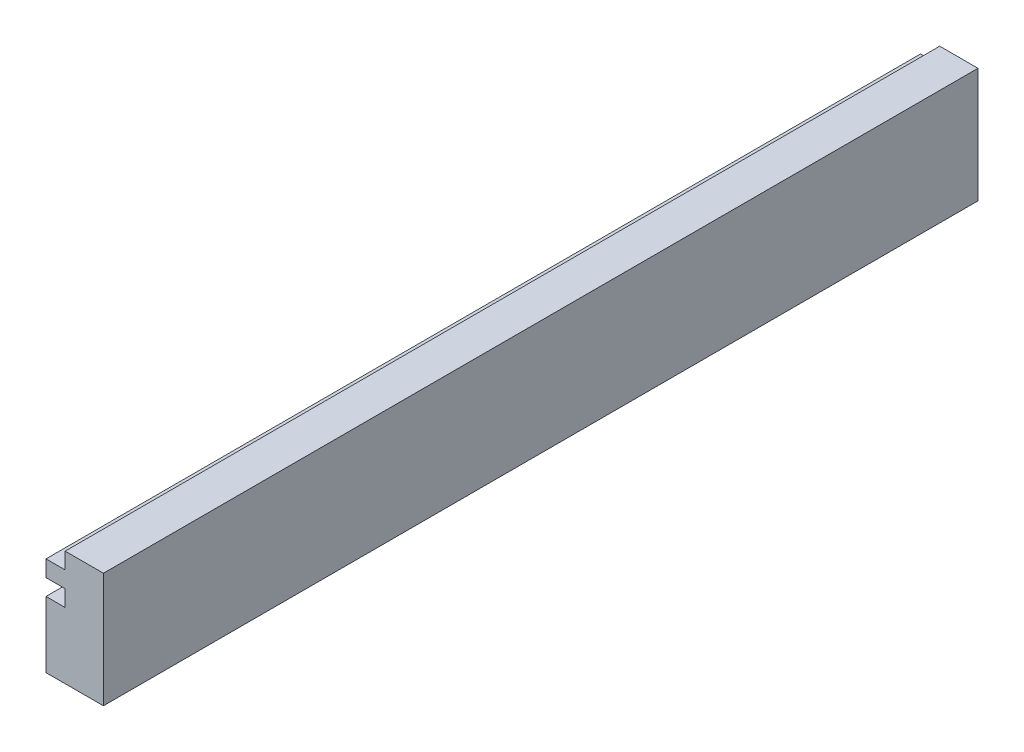
ISO-10303-21;
HEADER;
FILE_DESCRIPTION(('STEP AP214'),'2;1');
FILE_NAME('part.step','',(''),(''),'','','');
FILE_SCHEMA(('AUTOMOTIVE_DESIGN { 1 0 10303 214 1 1 1 1 }'));
ENDSEC;
DATA;
#1=APPLICATION_CONTEXT('core data for automotive mechanical design processes');
#2=APPLICATION_PROTOCOL_DEFINITION('international standard','automotive_design',2000,#1);
#3=PRODUCT_CONTEXT('',#1,'mechanical');
#4=PRODUCT('Part','Part','',(#3));
#5=PRODUCT_RELATED_PRODUCT_CATEGORY('part','',(#4));
#6=PRODUCT_DEFINITION_FORMATION('','',#4);
#7=PRODUCT_DEFINITION_CONTEXT('part definition',#1,'design');
#8=PRODUCT_DEFINITION('design','',#6,#7);
#9=PRODUCT_DEFINITION_SHAPE('','',#8);
#10=(LENGTH_UNIT() NAMED_UNIT(*) SI_UNIT(.MILLI.,.METRE.));
#11=(NAMED_UNIT(*) PLANE_ANGLE_UNIT() SI_UNIT($,.RADIAN.));
#12=(NAMED_UNIT(*) SI_UNIT($,.STERADIAN.) SOLID_ANGLE_UNIT());
#13=UNCERTAINTY_MEASURE_WITH_UNIT(LENGTH_MEASURE(1.E-05),#10,'distance_accuracy_value','');
#14=(GEOMETRIC_REPRESENTATION_CONTEXT(3) GLOBAL_UNCERTAINTY_ASSIGNED_CONTEXT((#13)) GLOBAL_UNIT_ASSIGNED_CONTEXT((#10,
#11,#12)) REPRESENTATION_CONTEXT('',''));
#15=CARTESIAN_POINT('',(0.,0.,0.));
#16=DIRECTION('',(0.,0.,1.));
#17=DIRECTION('',(1.,0.,0.));
#18=AXIS2_PLACEMENT_3D('',#15,#16,#17);
#19=CARTESIAN_POINT('',(0.,0.,457.));
#20=DIRECTION('',(1.,0.,0.));
#21=DIRECTION('',(0.,0.,-1.));
#22=AXIS2_PLACEMENT_3D('',#19,#20,#21);
#23=PLANE('',#22);
#24=DIRECTION('',(0.,0.,1.));
#25=VECTOR('',#24,1.);
#26=CARTESIAN_POINT('',(0.,43.,-43.));
#27=LINE('',#26,#25);
#28=CARTESIAN_POINT('',(0.,43.,0.));
#29=VERTEX_POINT('',#28);
#30=CARTESIAN_POINT('',(0.,43.,457.));
#31=VERTEX_POINT('',#30);
#32=EDGE_CURVE('E172',#29,#31,#27,.T.);
#33=ORIENTED_EDGE('',*,*,#32,.T.);
#34=DIRECTION('',(0.,-1.,0.));
#35=VECTOR('',#34,1.);
#36=CARTESIAN_POINT('',(0.,0.,457.));
#37=LINE('',#36,#35);
#38=CARTESIAN_POINT('',(0.,51.5,457.));
#39=VERTEX_POINT('',#38);
#40=EDGE_CURVE('E195',#39,#31,#37,.T.);
#41=ORIENTED_EDGE('',*,*,#40,.F.);
#42=DIRECTION('',(0.,0.,1.));
#43=VECTOR('',#42,1.);
#44=CARTESIAN_POINT('',(0.,51.5,-43.));
#45=LINE('',#44,#43);
#46=CARTESIAN_POINT('',(0.,51.5,0.));
#47=VERTEX_POINT('',#46);
#48=EDGE_CURVE('E186',#47,#39,#45,.T.);
#49=ORIENTED_EDGE('',*,*,#48,.F.);
#50=DIRECTION('',(0.,-1.,0.));
#51=VECTOR('',#50,1.);
#52=CARTESIAN_POINT('',(0.,0.,0.));
#53=LINE('',#52,#51);
#54=EDGE_CURVE('E206',#47,#29,#53,.T.);
#55=ORIENTED_EDGE('',*,*,#54,.T.);
#56=EDGE_LOOP('',(#33,#41,#49,#55));
#57=FACE_BOUND('',#56,.T.);
#58=ADVANCED_FACE('F33',(#57),#23,.F.);
#59=CARTESIAN_POINT('',(0.,60.,457.));
#60=DIRECTION('',(0.,-1.,0.));
#61=DIRECTION('',(0.,0.,-1.));
#62=AXIS2_PLACEMENT_3D('',#59,#60,#61);
#63=PLANE('',#62);
#64=DIRECTION('',(0.,0.,1.));
#65=VECTOR('',#64,1.);
#66=CARTESIAN_POINT('',(10.,60.,-43.));
#67=LINE('',#66,#65);
#68=CARTESIAN_POINT('',(10.,60.,0.));
#69=VERTEX_POINT('',#68);
#70=CARTESIAN_POINT('',(10.,60.,457.));
#71=VERTEX_POINT('',#70);
#72=EDGE_CURVE('E183',#69,#71,#67,.T.);
#73=ORIENTED_EDGE('',*,*,#72,.T.);
#74=DIRECTION('',(-1.,0.,0.));
#75=VECTOR('',#74,1.);
#76=CARTESIAN_POINT('',(0.,60.,457.));
#77=LINE('',#76,#75);
#78=CARTESIAN_POINT('',(30.,60.,457.));
#79=VERTEX_POINT('',#78);
#80=EDGE_CURVE('E201',#79,#71,#77,.T.);
#81=ORIENTED_EDGE('',*,*,#80,.F.);
#82=DIRECTION('',(0.,0.,-1.));
#83=VECTOR('',#82,1.);
#84=CARTESIAN_POINT('',(30.,60.,457.));
#85=LINE('',#84,#83);
#86=CARTESIAN_POINT('',(30.,60.,0.));
#87=VERTEX_POINT('',#86);
#88=EDGE_CURVE('E204',#79,#87,#85,.T.);
#89=ORIENTED_EDGE('',*,*,#88,.T.);
#90=DIRECTION('',(-1.,0.,0.));
#91=VECTOR('',#90,1.);
#92=CARTESIAN_POINT('',(0.,60.,0.));
#93=LINE('',#92,#91);
#94=EDGE_CURVE('E196',#87,#69,#93,.T.);
#95=ORIENTED_EDGE('',*,*,#94,.T.);
#96=EDGE_LOOP('',(#73,#81,#89,#95));
#97=FACE_BOUND('',#96,.T.);
#98=ADVANCED_FACE('F287',(#97),#63,.F.);
#99=CARTESIAN_POINT('',(0.,0.,457.));
#100=DIRECTION('',(0.,0.,-1.));
#101=DIRECTION('',(-1.,0.,0.));
#102=AXIS2_PLACEMENT_3D('',#99,#100,#101);
#103=PLANE('',#102);
#104=DIRECTION('',(1.,0.,0.));
#105=VECTOR('',#104,1.);
#106=CARTESIAN_POINT('',(0.,43.,457.));
#107=LINE('',#106,#105);
#108=CARTESIAN_POINT('',(10.0000000000002,43.,457.));
#109=VERTEX_POINT('',#108);
#110=EDGE_CURVE('E168',#31,#109,#107,.T.);
#111=ORIENTED_EDGE('',*,*,#110,.T.);
#112=DIRECTION('',(0.,-1.,0.));
#113=VECTOR('',#112,1.);
#114=CARTESIAN_POINT('',(10.0000000000002,0.,457.));
#115=LINE('',#114,#113);
#116=CARTESIAN_POINT('',(10.0000000000002,34.5,457.));
#117=VERTEX_POINT('',#116);
#118=EDGE_CURVE('E164',#109,#117,#115,.T.);
#119=ORIENTED_EDGE('',*,*,#118,.T.);
#120=DIRECTION('',(1.,0.,0.));
#121=VECTOR('',#120,1.);
#122=CARTESIAN_POINT('',(0.,34.5,457.));
#123=LINE('',#122,#121);
#124=CARTESIAN_POINT('',(0.,34.5,457.));
#125=VERTEX_POINT('',#124);
#126=EDGE_CURVE('E162',#125,#117,#123,.T.);
#127=ORIENTED_EDGE('',*,*,#126,.F.);
#128=CARTESIAN_POINT('',(0.,0.,457.));
#129=VERTEX_POINT('',#128);
#130=EDGE_CURVE('E193',#125,#129,#37,.T.);
#131=ORIENTED_EDGE('',*,*,#130,.T.);
#132=DIRECTION('',(1.,0.,0.));
#133=VECTOR('',#132,1.);
#134=CARTESIAN_POINT('',(0.,0.,457.));
#135=LINE('',#134,#133);
#136=CARTESIAN_POINT('',(30.,0.,457.));
#137=VERTEX_POINT('',#136);
#138=EDGE_CURVE('E197',#129,#137,#135,.T.);
#139=ORIENTED_EDGE('',*,*,#138,.T.);
#140=DIRECTION('',(0.,1.,0.));
#141=VECTOR('',#140,1.);
#142=CARTESIAN_POINT('',(30.,0.,457.));
#143=LINE('',#142,#141);
#144=EDGE_CURVE('E199',#137,#79,#143,.T.);
#145=ORIENTED_EDGE('',*,*,#144,.T.);
#146=ORIENTED_EDGE('',*,*,#80,.T.);
#147=DIRECTION('',(0.,-1.,0.));
#148=VECTOR('',#147,1.);
#149=CARTESIAN_POINT('',(10.,60.,457.));
#150=LINE('',#149,#148);
#151=CARTESIAN_POINT('',(10.,51.5,457.));
#152=VERTEX_POINT('',#151);
#153=EDGE_CURVE('E182',#71,#152,#150,.T.);
#154=ORIENTED_EDGE('',*,*,#153,.T.);
#155=DIRECTION('',(1.,0.,0.));
#156=VECTOR('',#155,1.);
#157=CARTESIAN_POINT('',(0.,51.5,457.));
#158=LINE('',#157,#156);
#159=EDGE_CURVE('E165',#39,#152,#158,.T.);
#160=ORIENTED_EDGE('',*,*,#159,.F.);
#161=ORIENTED_EDGE('',*,*,#40,.T.);
#162=EDGE_LOOP('',(#111,#119,#127,#131,#139,#145,#146,#154,#160,#161));
#163=FACE_BOUND('',#162,.T.);
#164=ADVANCED_FACE('F246',(#163),#103,.F.);
#165=CARTESIAN_POINT('',(0.,0.,0.));
#166=DIRECTION('',(0.,0.,-1.));
#167=DIRECTION('',(-1.,0.,0.));
#168=AXIS2_PLACEMENT_3D('',#165,#166,#167);
#169=PLANE('',#168);
#170=DIRECTION('',(-1.,0.,0.));
#171=VECTOR('',#170,1.);
#172=CARTESIAN_POINT('',(0.,17.5,0.));
#173=LINE('',#172,#171);
#174=CARTESIAN_POINT('',(10.,17.5,0.));
#175=VERTEX_POINT('',#174);
#176=CARTESIAN_POINT('',(0.,17.5,0.));
#177=VERTEX_POINT('',#176);
#178=EDGE_CURVE('E150',#175,#177,#173,.T.);
#179=ORIENTED_EDGE('',*,*,#178,.F.);
#180=DIRECTION('',(0.,-1.,0.));
#181=VECTOR('',#180,1.);
#182=CARTESIAN_POINT('',(10.,26.,0.));
#183=LINE('',#182,#181);
#184=CARTESIAN_POINT('',(10.,26.,0.));
#185=VERTEX_POINT('',#184);
#186=EDGE_CURVE('E267',#185,#175,#183,.T.);
#187=ORIENTED_EDGE('',*,*,#186,.F.);
#188=DIRECTION('',(1.,0.,0.));
#189=VECTOR('',#188,1.);
#190=CARTESIAN_POINT('',(0.,26.,0.));
#191=LINE('',#190,#189);
#192=CARTESIAN_POINT('',(0.,26.,0.));
#193=VERTEX_POINT('',#192);
#194=EDGE_CURVE('E265',#193,#185,#191,.T.);
#195=ORIENTED_EDGE('',*,*,#194,.F.);
#196=CARTESIAN_POINT('',(0.,34.5,0.));
#197=VERTEX_POINT('',#196);
#198=EDGE_CURVE('E155',#197,#193,#53,.T.);
#199=ORIENTED_EDGE('',*,*,#198,.F.);
#200=DIRECTION('',(-1.,0.,0.));
#201=VECTOR('',#200,1.);
#202=CARTESIAN_POINT('',(0.,34.5,0.));
#203=LINE('',#202,#201);
#204=CARTESIAN_POINT('',(10.0000000000002,34.5,0.));
#205=VERTEX_POINT('',#204);
#206=EDGE_CURVE('E226',#205,#197,#203,.T.);
#207=ORIENTED_EDGE('',*,*,#206,.F.);
#208=DIRECTION('',(0.,1.,0.));
#209=VECTOR('',#208,1.);
#210=CARTESIAN_POINT('',(10.0000000000002,0.,0.));
#211=LINE('',#210,#209);
#212=CARTESIAN_POINT('',(10.0000000000002,43.,0.));
#213=VERTEX_POINT('',#212);
#214=EDGE_CURVE('E41',#205,#213,#211,.T.);
#215=ORIENTED_EDGE('',*,*,#214,.T.);
#216=DIRECTION('',(-1.,0.,0.));
#217=VECTOR('',#216,1.);
#218=CARTESIAN_POINT('',(0.,43.,0.));
#219=LINE('',#218,#217);
#220=EDGE_CURVE('E11',#213,#29,#219,.T.);
#221=ORIENTED_EDGE('',*,*,#220,.T.);
#222=ORIENTED_EDGE('',*,*,#54,.F.);
#223=DIRECTION('',(-1.,0.,0.));
#224=VECTOR('',#223,1.);
#225=CARTESIAN_POINT('',(0.,51.5,0.));
#226=LINE('',#225,#224);
#227=CARTESIAN_POINT('',(10.,51.5,0.));
#228=VERTEX_POINT('',#227);
#229=EDGE_CURVE('E224',#228,#47,#226,.T.);
#230=ORIENTED_EDGE('',*,*,#229,.F.);
#231=DIRECTION('',(0.,1.,0.));
#232=VECTOR('',#231,1.);
#233=CARTESIAN_POINT('',(10.,0.,0.));
#234=LINE('',#233,#232);
#235=EDGE_CURVE('E221',#228,#69,#234,.T.);
#236=ORIENTED_EDGE('',*,*,#235,.T.);
#237=ORIENTED_EDGE('',*,*,#94,.F.);
#238=DIRECTION('',(0.,1.,0.));
#239=VECTOR('',#238,1.);
#240=CARTESIAN_POINT('',(30.,0.,0.));
#241=LINE('',#240,#239);
#242=CARTESIAN_POINT('',(30.,0.,0.));
#243=VERTEX_POINT('',#242);
#244=EDGE_CURVE('E209',#243,#87,#241,.T.);
#245=ORIENTED_EDGE('',*,*,#244,.F.);
#246=DIRECTION('',(1.,0.,0.));
#247=VECTOR('',#246,1.);
#248=CARTESIAN_POINT('',(0.,0.,0.));
#249=LINE('',#248,#247);
#250=CARTESIAN_POINT('',(0.,0.,0.));
#251=VERTEX_POINT('',#250);
#252=EDGE_CURVE('E207',#251,#243,#249,.T.);
#253=ORIENTED_EDGE('',*,*,#252,.F.);
#254=EDGE_CURVE('E175',#177,#251,#53,.T.);
#255=ORIENTED_EDGE('',*,*,#254,.F.);
#256=EDGE_LOOP('',(#179,#187,#195,#199,#207,#215,#221,#222,#230,#236,#237,#245,#253,#255));
#257=FACE_BOUND('',#256,.T.);
#258=ADVANCED_FACE('F231',(#257),#169,.T.);
#259=DIRECTION('',(0.,1.,0.));
#260=VECTOR('',#259,1.);
#261=CARTESIAN_POINT('',(0.,26.,42.89));
#262=LINE('',#261,#260);
#263=CARTESIAN_POINT('',(0.,17.5,42.89));
#264=VERTEX_POINT('',#263);
#265=CARTESIAN_POINT('',(0.,26.,42.89));
#266=VERTEX_POINT('',#265);
#267=EDGE_CURVE('E144',#264,#266,#262,.T.);
#268=ORIENTED_EDGE('',*,*,#267,.F.);
#269=DIRECTION('',(0.,0.,-1.));
#270=VECTOR('',#269,1.);
#271=CARTESIAN_POINT('',(0.,17.5,42.89));
#272=LINE('',#271,#270);
#273=EDGE_CURVE('E188',#264,#177,#272,.T.);
#274=ORIENTED_EDGE('',*,*,#273,.T.);
#275=ORIENTED_EDGE('',*,*,#254,.T.);
#276=DIRECTION('',(0.,0.,-1.));
#277=VECTOR('',#276,1.);
#278=CARTESIAN_POINT('',(0.,0.,457.));
#279=LINE('',#278,#277);
#280=EDGE_CURVE('E218',#129,#251,#279,.T.);
#281=ORIENTED_EDGE('',*,*,#280,.F.);
#282=ORIENTED_EDGE('',*,*,#130,.F.);
#283=DIRECTION('',(0.,0.,1.));
#284=VECTOR('',#283,1.);
#285=CARTESIAN_POINT('',(0.,34.5,-43.));
#286=LINE('',#285,#284);
#287=EDGE_CURVE('E171',#197,#125,#286,.T.);
#288=ORIENTED_EDGE('',*,*,#287,.F.);
#289=ORIENTED_EDGE('',*,*,#198,.T.);
#290=DIRECTION('',(0.,0.,-1.));
#291=VECTOR('',#290,1.);
#292=CARTESIAN_POINT('',(0.,26.,42.89));
#293=LINE('',#292,#291);
#294=EDGE_CURVE('E139',#266,#193,#293,.T.);
#295=ORIENTED_EDGE('',*,*,#294,.F.);
#296=EDGE_LOOP('',(#268,#274,#275,#281,#282,#288,#289,#295));
#297=FACE_BOUND('',#296,.T.);
#298=ADVANCED_FACE('F35',(#297),#23,.F.);
#299=CARTESIAN_POINT('',(0.,0.,457.));
#300=DIRECTION('',(0.,1.,0.));
#301=DIRECTION('',(0.,0.,1.));
#302=AXIS2_PLACEMENT_3D('',#299,#300,#301);
#303=PLANE('',#302);
#304=ORIENTED_EDGE('',*,*,#252,.T.);
#305=DIRECTION('',(0.,0.,-1.));
#306=VECTOR('',#305,1.);
#307=CARTESIAN_POINT('',(30.,0.,457.));
#308=LINE('',#307,#306);
#309=EDGE_CURVE('E215',#137,#243,#308,.T.);
#310=ORIENTED_EDGE('',*,*,#309,.F.);
#311=ORIENTED_EDGE('',*,*,#138,.F.);
#312=ORIENTED_EDGE('',*,*,#280,.T.);
#313=EDGE_LOOP('',(#304,#310,#311,#312));
#314=FACE_BOUND('',#313,.T.);
#315=ADVANCED_FACE('F260',(#314),#303,.F.);
#316=CARTESIAN_POINT('',(30.,0.,457.));
#317=DIRECTION('',(-1.,0.,0.));
#318=DIRECTION('',(0.,0.,1.));
#319=AXIS2_PLACEMENT_3D('',#316,#317,#318);
#320=PLANE('',#319);
#321=ORIENTED_EDGE('',*,*,#244,.T.);
#322=ORIENTED_EDGE('',*,*,#88,.F.);
#323=ORIENTED_EDGE('',*,*,#144,.F.);
#324=ORIENTED_EDGE('',*,*,#309,.T.);
#325=EDGE_LOOP('',(#321,#322,#323,#324));
#326=FACE_BOUND('',#325,.T.);
#327=ADVANCED_FACE('F298',(#326),#320,.F.);
#328=CARTESIAN_POINT('',(0.,51.5,-43.));
#329=DIRECTION('',(0.,-1.,0.));
#330=DIRECTION('',(0.,0.,-1.));
#331=AXIS2_PLACEMENT_3D('',#328,#329,#330);
#332=PLANE('',#331);
#333=ORIENTED_EDGE('',*,*,#229,.T.);
#334=ORIENTED_EDGE('',*,*,#48,.T.);
#335=ORIENTED_EDGE('',*,*,#159,.T.);
#336=DIRECTION('',(0.,0.,1.));
#337=VECTOR('',#336,1.);
#338=CARTESIAN_POINT('',(10.,51.5,-43.));
#339=LINE('',#338,#337);
#340=EDGE_CURVE('E180',#228,#152,#339,.T.);
#341=ORIENTED_EDGE('',*,*,#340,.F.);
#342=EDGE_LOOP('',(#333,#334,#335,#341));
#343=FACE_BOUND('',#342,.T.);
#344=ADVANCED_FACE('F249',(#343),#332,.F.);
#345=CARTESIAN_POINT('',(10.,60.,-43.));
#346=DIRECTION('',(-1.,0.,0.));
#347=DIRECTION('',(0.,-1.,0.));
#348=AXIS2_PLACEMENT_3D('',#345,#346,#347);
#349=PLANE('',#348);
#350=ORIENTED_EDGE('',*,*,#340,.T.);
#351=ORIENTED_EDGE('',*,*,#153,.F.);
#352=ORIENTED_EDGE('',*,*,#72,.F.);
#353=ORIENTED_EDGE('',*,*,#235,.F.);
#354=EDGE_LOOP('',(#350,#351,#352,#353));
#355=FACE_BOUND('',#354,.T.);
#356=ADVANCED_FACE('F311',(#355),#349,.T.);
#357=CARTESIAN_POINT('',(0.,43.,-43.));
#358=DIRECTION('',(0.,-1.,0.));
#359=DIRECTION('',(0.,0.,-1.));
#360=AXIS2_PLACEMENT_3D('',#357,#358,#359);
#361=PLANE('',#360);
#362=DIRECTION('',(0.,0.,1.));
#363=VECTOR('',#362,1.);
#364=CARTESIAN_POINT('',(10.0000000000002,43.,-43.));
#365=LINE('',#364,#363);
#366=EDGE_CURVE('E176',#213,#109,#365,.T.);
#367=ORIENTED_EDGE('',*,*,#366,.T.);
#368=ORIENTED_EDGE('',*,*,#110,.F.);
#369=ORIENTED_EDGE('',*,*,#32,.F.);
#370=ORIENTED_EDGE('',*,*,#220,.F.);
#371=EDGE_LOOP('',(#367,#368,#369,#370));
#372=FACE_BOUND('',#371,.T.);
#373=ADVANCED_FACE('F239',(#372),#361,.T.);
#374=CARTESIAN_POINT('',(10.0000000000002,0.,-43.));
#375=DIRECTION('',(-1.,0.,0.));
#376=DIRECTION('',(0.,0.,1.));
#377=AXIS2_PLACEMENT_3D('',#374,#375,#376);
#378=PLANE('',#377);
#379=DIRECTION('',(0.,0.,1.));
#380=VECTOR('',#379,1.);
#381=CARTESIAN_POINT('',(10.0000000000002,34.5,-43.));
#382=LINE('',#381,#380);
#383=EDGE_CURVE('E56',#205,#117,#382,.T.);
#384=ORIENTED_EDGE('',*,*,#383,.T.);
#385=ORIENTED_EDGE('',*,*,#118,.F.);
#386=ORIENTED_EDGE('',*,*,#366,.F.);
#387=ORIENTED_EDGE('',*,*,#214,.F.);
#388=EDGE_LOOP('',(#384,#385,#386,#387));
#389=FACE_BOUND('',#388,.T.);
#390=ADVANCED_FACE('F236',(#389),#378,.T.);
#391=CARTESIAN_POINT('',(0.,34.5,-43.));
#392=DIRECTION('',(0.,-1.,0.));
#393=DIRECTION('',(0.,0.,-1.));
#394=AXIS2_PLACEMENT_3D('',#391,#392,#393);
#395=PLANE('',#394);
#396=ORIENTED_EDGE('',*,*,#206,.T.);
#397=ORIENTED_EDGE('',*,*,#287,.T.);
#398=ORIENTED_EDGE('',*,*,#126,.T.);
#399=ORIENTED_EDGE('',*,*,#383,.F.);
#400=EDGE_LOOP('',(#396,#397,#398,#399));
#401=FACE_BOUND('',#400,.T.);
#402=ADVANCED_FACE('F284',(#401),#395,.F.);
#403=CARTESIAN_POINT('',(0.,17.5,42.89));
#404=DIRECTION('',(0.,-1.,0.));
#405=DIRECTION('',(0.,0.,-1.));
#406=AXIS2_PLACEMENT_3D('',#403,#404,#405);
#407=PLANE('',#406);
#408=ORIENTED_EDGE('',*,*,#178,.T.);
#409=ORIENTED_EDGE('',*,*,#273,.F.);
#410=DIRECTION('',(-1.,0.,0.));
#411=VECTOR('',#410,1.);
#412=CARTESIAN_POINT('',(0.,17.5,42.89));
#413=LINE('',#412,#411);
#414=CARTESIAN_POINT('',(10.,17.5,42.89));
#415=VERTEX_POINT('',#414);
#416=EDGE_CURVE('E48',#415,#264,#413,.T.);
#417=ORIENTED_EDGE('',*,*,#416,.F.);
#418=DIRECTION('',(0.,0.,-1.));
#419=VECTOR('',#418,1.);
#420=CARTESIAN_POINT('',(10.,17.5,42.89));
#421=LINE('',#420,#419);
#422=EDGE_CURVE('E157',#415,#175,#421,.T.);
#423=ORIENTED_EDGE('',*,*,#422,.T.);
#424=EDGE_LOOP('',(#408,#409,#417,#423));
#425=FACE_BOUND('',#424,.T.);
#426=ADVANCED_FACE('F274',(#425),#407,.F.);
#427=CARTESIAN_POINT('',(10.,26.,42.89));
#428=DIRECTION('',(1.,0.,0.));
#429=DIRECTION('',(0.,1.,0.));
#430=AXIS2_PLACEMENT_3D('',#427,#428,#429);
#431=PLANE('',#430);
#432=ORIENTED_EDGE('',*,*,#186,.T.);
#433=ORIENTED_EDGE('',*,*,#422,.F.);
#434=DIRECTION('',(0.,-1.,0.));
#435=VECTOR('',#434,1.);
#436=CARTESIAN_POINT('',(10.,26.,42.89));
#437=LINE('',#436,#435);
#438=CARTESIAN_POINT('',(10.,26.,42.89));
#439=VERTEX_POINT('',#438);
#440=EDGE_CURVE('E143',#439,#415,#437,.T.);
#441=ORIENTED_EDGE('',*,*,#440,.F.);
#442=DIRECTION('',(0.,0.,-1.));
#443=VECTOR('',#442,1.);
#444=CARTESIAN_POINT('',(10.,26.,42.89));
#445=LINE('',#444,#443);
#446=EDGE_CURVE('E141',#439,#185,#445,.T.);
#447=ORIENTED_EDGE('',*,*,#446,.T.);
#448=EDGE_LOOP('',(#432,#433,#441,#447));
#449=FACE_BOUND('',#448,.T.);
#450=ADVANCED_FACE('F276',(#449),#431,.F.);
#451=CARTESIAN_POINT('',(0.,26.,42.89));
#452=DIRECTION('',(0.,1.,0.));
#453=DIRECTION('',(0.,0.,1.));
#454=AXIS2_PLACEMENT_3D('',#451,#452,#453);
#455=PLANE('',#454);
#456=ORIENTED_EDGE('',*,*,#194,.T.);
#457=ORIENTED_EDGE('',*,*,#446,.F.);
#458=DIRECTION('',(1.,0.,0.));
#459=VECTOR('',#458,1.);
#460=CARTESIAN_POINT('',(0.,26.,42.89));
#461=LINE('',#460,#459);
#462=EDGE_CURVE('E135',#266,#439,#461,.T.);
#463=ORIENTED_EDGE('',*,*,#462,.F.);
#464=ORIENTED_EDGE('',*,*,#294,.T.);
#465=EDGE_LOOP('',(#456,#457,#463,#464));
#466=FACE_BOUND('',#465,.T.);
#467=ADVANCED_FACE('F137',(#466),#455,.F.);
#468=CARTESIAN_POINT('',(0.,0.,42.89));
#469=DIRECTION('',(0.,0.,1.));
#470=DIRECTION('',(1.,0.,0.));
#471=AXIS2_PLACEMENT_3D('',#468,#469,#470);
#472=PLANE('',#471);
#473=ORIENTED_EDGE('',*,*,#267,.T.);
#474=ORIENTED_EDGE('',*,*,#462,.T.);
#475=ORIENTED_EDGE('',*,*,#440,.T.);
#476=ORIENTED_EDGE('',*,*,#416,.T.);
#477=EDGE_LOOP('',(#473,#474,#475,#476));
#478=FACE_BOUND('',#477,.T.);
#479=ADVANCED_FACE('F147',(#478),#472,.F.);
#480=CLOSED_SHELL('',(#58,#98,#164,#258,#298,#315,#327,#344,#356,#373,#390,#402,#426,#450,#467,#479));
#481=MANIFOLD_SOLID_BREP('B2',#480);
#482=ADVANCED_BREP_SHAPE_REPRESENTATION('',(#18,#481),#14);
#483=SHAPE_DEFINITION_REPRESENTATION(#9,#482);
ENDSEC;
END-ISO-10303-21;
